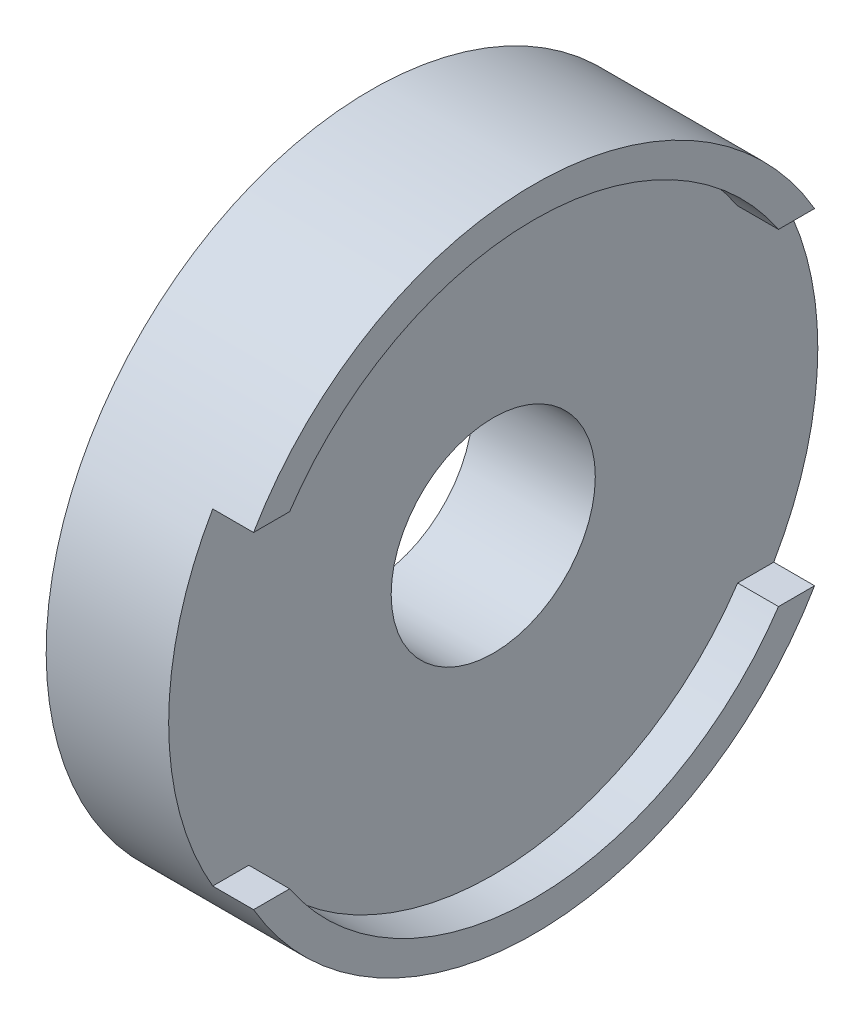
ISO-10303-21;
HEADER;
FILE_DESCRIPTION(('STEP AP214'),'2;1');
FILE_NAME('part.step','',(''),(''),'','','');
FILE_SCHEMA(('AUTOMOTIVE_DESIGN { 1 0 10303 214 1 1 1 1 }'));
ENDSEC;
DATA;
#1=APPLICATION_CONTEXT('core data for automotive mechanical design processes');
#2=APPLICATION_PROTOCOL_DEFINITION('international standard','automotive_design',2000,#1);
#3=PRODUCT_CONTEXT('',#1,'mechanical');
#4=PRODUCT('Part','Part','',(#3));
#5=PRODUCT_RELATED_PRODUCT_CATEGORY('part','',(#4));
#6=PRODUCT_DEFINITION_FORMATION('','',#4);
#7=PRODUCT_DEFINITION_CONTEXT('part definition',#1,'design');
#8=PRODUCT_DEFINITION('design','',#6,#7);
#9=PRODUCT_DEFINITION_SHAPE('','',#8);
#10=(LENGTH_UNIT() NAMED_UNIT(*) SI_UNIT(.MILLI.,.METRE.));
#11=(NAMED_UNIT(*) PLANE_ANGLE_UNIT() SI_UNIT($,.RADIAN.));
#12=(NAMED_UNIT(*) SI_UNIT($,.STERADIAN.) SOLID_ANGLE_UNIT());
#13=UNCERTAINTY_MEASURE_WITH_UNIT(LENGTH_MEASURE(1.E-05),#10,'distance_accuracy_value','');
#14=(GEOMETRIC_REPRESENTATION_CONTEXT(3) GLOBAL_UNCERTAINTY_ASSIGNED_CONTEXT((#13)) GLOBAL_UNIT_ASSIGNED_CONTEXT((#10,
#11,#12)) REPRESENTATION_CONTEXT('',''));
#15=CARTESIAN_POINT('',(0.,0.,0.));
#16=DIRECTION('',(0.,0.,1.));
#17=DIRECTION('',(1.,0.,0.));
#18=AXIS2_PLACEMENT_3D('',#15,#16,#17);
#19=CARTESIAN_POINT('',(6.,0.,0.));
#20=DIRECTION('',(1.,0.,0.));
#21=DIRECTION('',(0.,0.,-1.));
#22=AXIS2_PLACEMENT_3D('',#19,#20,#21);
#23=PLANE('',#22);
#24=CARTESIAN_POINT('',(6.,0.,0.));
#25=DIRECTION('',(1.,0.,0.));
#26=DIRECTION('',(0.,0.,-1.));
#27=AXIS2_PLACEMENT_3D('',#24,#25,#26);
#28=CIRCLE('',#27,5.);
#29=CARTESIAN_POINT('',(6.,0.,-5.));
#30=VERTEX_POINT('',#29);
#31=EDGE_CURVE('E192',#30,#30,#28,.T.);
#32=ORIENTED_EDGE('',*,*,#31,.F.);
#33=EDGE_LOOP('',(#32));
#34=FACE_BOUND('',#33,.T.);
#35=CARTESIAN_POINT('',(6.,0.,0.));
#36=DIRECTION('',(1.,0.,0.));
#37=DIRECTION('',(0.,0.,-1.));
#38=AXIS2_PLACEMENT_3D('',#35,#36,#37);
#39=CIRCLE('',#38,15.9);
#40=CARTESIAN_POINT('',(6.,8.,13.7408151141044));
#41=VERTEX_POINT('',#40);
#42=CARTESIAN_POINT('',(6.,-8.,13.7408151141044));
#43=VERTEX_POINT('',#42);
#44=EDGE_CURVE('E11',#41,#43,#39,.T.);
#45=ORIENTED_EDGE('',*,*,#44,.T.);
#46=DIRECTION('',(0.,0.,1.));
#47=VECTOR('',#46,1.);
#48=CARTESIAN_POINT('',(6.,-8.,13.7408151141044));
#49=LINE('',#48,#47);
#50=CARTESIAN_POINT('',(6.,-8.,11.9733036376766));
#51=VERTEX_POINT('',#50);
#52=EDGE_CURVE('E48',#51,#43,#49,.T.);
#53=ORIENTED_EDGE('',*,*,#52,.F.);
#54=CARTESIAN_POINT('',(6.,0.,0.));
#55=DIRECTION('',(-1.,0.,0.));
#56=DIRECTION('',(0.,0.,-1.));
#57=AXIS2_PLACEMENT_3D('',#54,#55,#56);
#58=CIRCLE('',#57,14.4);
#59=CARTESIAN_POINT('',(6.,-8.,-11.9733036376766));
#60=VERTEX_POINT('',#59);
#61=EDGE_CURVE('E53',#60,#51,#58,.T.);
#62=ORIENTED_EDGE('',*,*,#61,.F.);
#63=DIRECTION('',(0.,0.,1.));
#64=VECTOR('',#63,1.);
#65=CARTESIAN_POINT('',(6.,-8.,-11.9733036376766));
#66=LINE('',#65,#64);
#67=CARTESIAN_POINT('',(6.,-8.,-13.7408151141044));
#68=VERTEX_POINT('',#67);
#69=EDGE_CURVE('E116',#68,#60,#66,.T.);
#70=ORIENTED_EDGE('',*,*,#69,.F.);
#71=CARTESIAN_POINT('',(6.,8.,-13.7408151141044));
#72=VERTEX_POINT('',#71);
#73=EDGE_CURVE('E36',#68,#72,#39,.T.);
#74=ORIENTED_EDGE('',*,*,#73,.T.);
#75=DIRECTION('',(0.,0.,-1.));
#76=VECTOR('',#75,1.);
#77=CARTESIAN_POINT('',(6.,8.,-11.9733036376766));
#78=LINE('',#77,#76);
#79=CARTESIAN_POINT('',(6.,8.,-11.9733036376766));
#80=VERTEX_POINT('',#79);
#81=EDGE_CURVE('E122',#80,#72,#78,.T.);
#82=ORIENTED_EDGE('',*,*,#81,.F.);
#83=CARTESIAN_POINT('',(6.,0.,0.));
#84=DIRECTION('',(-1.,0.,0.));
#85=DIRECTION('',(0.,0.,-1.));
#86=AXIS2_PLACEMENT_3D('',#83,#84,#85);
#87=CIRCLE('',#86,14.4);
#88=CARTESIAN_POINT('',(6.,8.,11.9733036376766));
#89=VERTEX_POINT('',#88);
#90=EDGE_CURVE('E119',#89,#80,#87,.T.);
#91=ORIENTED_EDGE('',*,*,#90,.F.);
#92=DIRECTION('',(0.,0.,-1.));
#93=VECTOR('',#92,1.);
#94=CARTESIAN_POINT('',(6.,8.,13.7408151141044));
#95=LINE('',#94,#93);
#96=EDGE_CURVE('E132',#41,#89,#95,.T.);
#97=ORIENTED_EDGE('',*,*,#96,.F.);
#98=EDGE_LOOP('',(#45,#53,#62,#70,#74,#82,#91,#97));
#99=FACE_BOUND('',#98,.T.);
#100=ADVANCED_FACE('F32',(#34,#99),#23,.T.);
#101=CARTESIAN_POINT('',(0.,0.,0.));
#102=DIRECTION('',(1.,0.,0.));
#103=DIRECTION('',(0.,0.,-1.));
#104=AXIS2_PLACEMENT_3D('',#101,#102,#103);
#105=PLANE('',#104);
#106=CARTESIAN_POINT('',(0.,0.,0.));
#107=DIRECTION('',(1.,0.,0.));
#108=DIRECTION('',(0.,0.,-1.));
#109=AXIS2_PLACEMENT_3D('',#106,#107,#108);
#110=CIRCLE('',#109,15.9);
#111=CARTESIAN_POINT('',(0.,0.,-15.9));
#112=VERTEX_POINT('',#111);
#113=EDGE_CURVE('E184',#112,#112,#110,.T.);
#114=ORIENTED_EDGE('',*,*,#113,.F.);
#115=EDGE_LOOP('',(#114));
#116=FACE_BOUND('',#115,.T.);
#117=CARTESIAN_POINT('',(0.,0.,0.));
#118=DIRECTION('',(1.,0.,0.));
#119=DIRECTION('',(0.,0.,-1.));
#120=AXIS2_PLACEMENT_3D('',#117,#118,#119);
#121=CIRCLE('',#120,5.);
#122=CARTESIAN_POINT('',(0.,0.,-5.));
#123=VERTEX_POINT('',#122);
#124=EDGE_CURVE('E190',#123,#123,#121,.T.);
#125=ORIENTED_EDGE('',*,*,#124,.T.);
#126=EDGE_LOOP('',(#125));
#127=FACE_BOUND('',#126,.T.);
#128=ADVANCED_FACE('F202',(#116,#127),#105,.F.);
#129=CARTESIAN_POINT('',(6.,0.,0.));
#130=DIRECTION('',(-1.,0.,0.));
#131=DIRECTION('',(0.,0.,1.));
#132=AXIS2_PLACEMENT_3D('',#129,#130,#131);
#133=CYLINDRICAL_SURFACE('',#132,15.9);
#134=ORIENTED_EDGE('',*,*,#44,.F.);
#135=DIRECTION('',(-1.,0.,0.));
#136=VECTOR('',#135,1.);
#137=CARTESIAN_POINT('',(8.,8.,13.7408151141044));
#138=LINE('',#137,#136);
#139=CARTESIAN_POINT('',(8.,8.,13.7408151141044));
#140=VERTEX_POINT('',#139);
#141=EDGE_CURVE('E149',#140,#41,#138,.T.);
#142=ORIENTED_EDGE('',*,*,#141,.F.);
#143=CARTESIAN_POINT('',(8.,0.,0.));
#144=DIRECTION('',(1.,0.,0.));
#145=DIRECTION('',(0.,0.,-1.));
#146=AXIS2_PLACEMENT_3D('',#143,#144,#145);
#147=CIRCLE('',#146,15.9);
#148=CARTESIAN_POINT('',(8.,8.,-13.7408151141044));
#149=VERTEX_POINT('',#148);
#150=EDGE_CURVE('E134',#149,#140,#147,.T.);
#151=ORIENTED_EDGE('',*,*,#150,.F.);
#152=DIRECTION('',(-1.,0.,0.));
#153=VECTOR('',#152,1.);
#154=CARTESIAN_POINT('',(8.,8.,-13.7408151141044));
#155=LINE('',#154,#153);
#156=EDGE_CURVE('E145',#149,#72,#155,.T.);
#157=ORIENTED_EDGE('',*,*,#156,.T.);
#158=ORIENTED_EDGE('',*,*,#73,.F.);
#159=DIRECTION('',(-1.,0.,0.));
#160=VECTOR('',#159,1.);
#161=CARTESIAN_POINT('',(8.,-8.,-13.7408151141044));
#162=LINE('',#161,#160);
#163=CARTESIAN_POINT('',(8.,-8.,-13.7408151141044));
#164=VERTEX_POINT('',#163);
#165=EDGE_CURVE('E124',#164,#68,#162,.T.);
#166=ORIENTED_EDGE('',*,*,#165,.F.);
#167=CARTESIAN_POINT('',(8.,0.,0.));
#168=DIRECTION('',(1.,0.,0.));
#169=DIRECTION('',(0.,0.,-1.));
#170=AXIS2_PLACEMENT_3D('',#167,#168,#169);
#171=CIRCLE('',#170,15.9);
#172=CARTESIAN_POINT('',(8.,-8.,13.7408151141044));
#173=VERTEX_POINT('',#172);
#174=EDGE_CURVE('E106',#173,#164,#171,.T.);
#175=ORIENTED_EDGE('',*,*,#174,.F.);
#176=DIRECTION('',(-1.,0.,0.));
#177=VECTOR('',#176,1.);
#178=CARTESIAN_POINT('',(8.,-8.,13.7408151141044));
#179=LINE('',#178,#177);
#180=EDGE_CURVE('E103',#173,#43,#179,.T.);
#181=ORIENTED_EDGE('',*,*,#180,.T.);
#182=EDGE_LOOP('',(#134,#142,#151,#157,#158,#166,#175,#181));
#183=FACE_BOUND('',#182,.T.);
#184=ORIENTED_EDGE('',*,*,#113,.T.);
#185=EDGE_LOOP('',(#184));
#186=FACE_BOUND('',#185,.T.);
#187=ADVANCED_FACE('F34',(#183,#186),#133,.T.);
#188=CARTESIAN_POINT('',(6.,0.,0.));
#189=DIRECTION('',(-1.,0.,0.));
#190=DIRECTION('',(0.,0.,1.));
#191=AXIS2_PLACEMENT_3D('',#188,#189,#190);
#192=CYLINDRICAL_SURFACE('',#191,5.);
#193=ORIENTED_EDGE('',*,*,#31,.T.);
#194=EDGE_LOOP('',(#193));
#195=FACE_BOUND('',#194,.T.);
#196=ORIENTED_EDGE('',*,*,#124,.F.);
#197=EDGE_LOOP('',(#196));
#198=FACE_BOUND('',#197,.T.);
#199=ADVANCED_FACE('F207',(#195,#198),#192,.F.);
#200=CARTESIAN_POINT('',(8.,0.,0.));
#201=DIRECTION('',(-1.,0.,0.));
#202=DIRECTION('',(0.,0.,1.));
#203=AXIS2_PLACEMENT_3D('',#200,#201,#202);
#204=CYLINDRICAL_SURFACE('',#203,14.4);
#205=ORIENTED_EDGE('',*,*,#90,.T.);
#206=DIRECTION('',(-1.,0.,0.));
#207=VECTOR('',#206,1.);
#208=CARTESIAN_POINT('',(8.,8.,-11.9733036376766));
#209=LINE('',#208,#207);
#210=CARTESIAN_POINT('',(8.,8.,-11.9733036376766));
#211=VERTEX_POINT('',#210);
#212=EDGE_CURVE('E148',#211,#80,#209,.T.);
#213=ORIENTED_EDGE('',*,*,#212,.F.);
#214=CARTESIAN_POINT('',(8.,0.,0.));
#215=DIRECTION('',(-1.,0.,0.));
#216=DIRECTION('',(0.,0.,-1.));
#217=AXIS2_PLACEMENT_3D('',#214,#215,#216);
#218=CIRCLE('',#217,14.4);
#219=CARTESIAN_POINT('',(8.,8.,11.9733036376766));
#220=VERTEX_POINT('',#219);
#221=EDGE_CURVE('E128',#220,#211,#218,.T.);
#222=ORIENTED_EDGE('',*,*,#221,.F.);
#223=DIRECTION('',(-1.,0.,0.));
#224=VECTOR('',#223,1.);
#225=CARTESIAN_POINT('',(8.,8.,11.9733036376766));
#226=LINE('',#225,#224);
#227=EDGE_CURVE('E137',#220,#89,#226,.T.);
#228=ORIENTED_EDGE('',*,*,#227,.T.);
#229=EDGE_LOOP('',(#205,#213,#222,#228));
#230=FACE_BOUND('',#229,.T.);
#231=ADVANCED_FACE('F165',(#230),#204,.F.);
#232=CARTESIAN_POINT('',(8.,8.,-11.9733036376766));
#233=DIRECTION('',(0.,1.,0.));
#234=DIRECTION('',(0.,0.,1.));
#235=AXIS2_PLACEMENT_3D('',#232,#233,#234);
#236=PLANE('',#235);
#237=ORIENTED_EDGE('',*,*,#81,.T.);
#238=ORIENTED_EDGE('',*,*,#156,.F.);
#239=DIRECTION('',(0.,0.,-1.));
#240=VECTOR('',#239,1.);
#241=CARTESIAN_POINT('',(8.,8.,-11.9733036376766));
#242=LINE('',#241,#240);
#243=EDGE_CURVE('E131',#211,#149,#242,.T.);
#244=ORIENTED_EDGE('',*,*,#243,.F.);
#245=ORIENTED_EDGE('',*,*,#212,.T.);
#246=EDGE_LOOP('',(#237,#238,#244,#245));
#247=FACE_BOUND('',#246,.T.);
#248=ADVANCED_FACE('F187',(#247),#236,.F.);
#249=CARTESIAN_POINT('',(8.,8.,13.7408151141044));
#250=DIRECTION('',(0.,1.,0.));
#251=DIRECTION('',(0.,0.,1.));
#252=AXIS2_PLACEMENT_3D('',#249,#250,#251);
#253=PLANE('',#252);
#254=ORIENTED_EDGE('',*,*,#96,.T.);
#255=ORIENTED_EDGE('',*,*,#227,.F.);
#256=DIRECTION('',(0.,0.,-1.));
#257=VECTOR('',#256,1.);
#258=CARTESIAN_POINT('',(8.,8.,13.7408151141044));
#259=LINE('',#258,#257);
#260=EDGE_CURVE('E136',#140,#220,#259,.T.);
#261=ORIENTED_EDGE('',*,*,#260,.F.);
#262=ORIENTED_EDGE('',*,*,#141,.T.);
#263=EDGE_LOOP('',(#254,#255,#261,#262));
#264=FACE_BOUND('',#263,.T.);
#265=ADVANCED_FACE('F167',(#264),#253,.F.);
#266=CARTESIAN_POINT('',(8.,0.,0.));
#267=DIRECTION('',(1.,0.,0.));
#268=DIRECTION('',(0.,0.,-1.));
#269=AXIS2_PLACEMENT_3D('',#266,#267,#268);
#270=PLANE('',#269);
#271=ORIENTED_EDGE('',*,*,#221,.T.);
#272=ORIENTED_EDGE('',*,*,#243,.T.);
#273=ORIENTED_EDGE('',*,*,#150,.T.);
#274=ORIENTED_EDGE('',*,*,#260,.T.);
#275=EDGE_LOOP('',(#271,#272,#273,#274));
#276=FACE_BOUND('',#275,.T.);
#277=ADVANCED_FACE('F189',(#276),#270,.T.);
#278=CARTESIAN_POINT('',(8.,0.,0.));
#279=DIRECTION('',(-1.,0.,0.));
#280=DIRECTION('',(0.,0.,1.));
#281=AXIS2_PLACEMENT_3D('',#278,#279,#280);
#282=CYLINDRICAL_SURFACE('',#281,14.4);
#283=ORIENTED_EDGE('',*,*,#61,.T.);
#284=DIRECTION('',(-1.,0.,0.));
#285=VECTOR('',#284,1.);
#286=CARTESIAN_POINT('',(8.,-8.,11.9733036376766));
#287=LINE('',#286,#285);
#288=CARTESIAN_POINT('',(8.,-8.,11.9733036376766));
#289=VERTEX_POINT('',#288);
#290=EDGE_CURVE('E101',#289,#51,#287,.T.);
#291=ORIENTED_EDGE('',*,*,#290,.F.);
#292=CARTESIAN_POINT('',(8.,0.,0.));
#293=DIRECTION('',(-1.,0.,0.));
#294=DIRECTION('',(0.,0.,-1.));
#295=AXIS2_PLACEMENT_3D('',#292,#293,#294);
#296=CIRCLE('',#295,14.4);
#297=CARTESIAN_POINT('',(8.,-8.,-11.9733036376766));
#298=VERTEX_POINT('',#297);
#299=EDGE_CURVE('E107',#298,#289,#296,.T.);
#300=ORIENTED_EDGE('',*,*,#299,.F.);
#301=DIRECTION('',(-1.,0.,0.));
#302=VECTOR('',#301,1.);
#303=CARTESIAN_POINT('',(8.,-8.,-11.9733036376766));
#304=LINE('',#303,#302);
#305=EDGE_CURVE('E175',#298,#60,#304,.T.);
#306=ORIENTED_EDGE('',*,*,#305,.T.);
#307=EDGE_LOOP('',(#283,#291,#300,#306));
#308=FACE_BOUND('',#307,.T.);
#309=ADVANCED_FACE('F118',(#308),#282,.F.);
#310=CARTESIAN_POINT('',(8.,-8.,13.7408151141044));
#311=DIRECTION('',(0.,-1.,0.));
#312=DIRECTION('',(0.,0.,-1.));
#313=AXIS2_PLACEMENT_3D('',#310,#311,#312);
#314=PLANE('',#313);
#315=ORIENTED_EDGE('',*,*,#52,.T.);
#316=ORIENTED_EDGE('',*,*,#180,.F.);
#317=DIRECTION('',(0.,0.,1.));
#318=VECTOR('',#317,1.);
#319=CARTESIAN_POINT('',(8.,-8.,13.7408151141044));
#320=LINE('',#319,#318);
#321=EDGE_CURVE('E97',#289,#173,#320,.T.);
#322=ORIENTED_EDGE('',*,*,#321,.F.);
#323=ORIENTED_EDGE('',*,*,#290,.T.);
#324=EDGE_LOOP('',(#315,#316,#322,#323));
#325=FACE_BOUND('',#324,.T.);
#326=ADVANCED_FACE('F99',(#325),#314,.F.);
#327=CARTESIAN_POINT('',(8.,-8.,-11.9733036376766));
#328=DIRECTION('',(0.,-1.,0.));
#329=DIRECTION('',(0.,0.,-1.));
#330=AXIS2_PLACEMENT_3D('',#327,#328,#329);
#331=PLANE('',#330);
#332=ORIENTED_EDGE('',*,*,#69,.T.);
#333=ORIENTED_EDGE('',*,*,#305,.F.);
#334=DIRECTION('',(0.,0.,1.));
#335=VECTOR('',#334,1.);
#336=CARTESIAN_POINT('',(8.,-8.,-11.9733036376766));
#337=LINE('',#336,#335);
#338=EDGE_CURVE('E112',#164,#298,#337,.T.);
#339=ORIENTED_EDGE('',*,*,#338,.F.);
#340=ORIENTED_EDGE('',*,*,#165,.T.);
#341=EDGE_LOOP('',(#332,#333,#339,#340));
#342=FACE_BOUND('',#341,.T.);
#343=ADVANCED_FACE('F182',(#342),#331,.F.);
#344=CARTESIAN_POINT('',(8.,0.,0.));
#345=DIRECTION('',(1.,0.,0.));
#346=DIRECTION('',(0.,0.,-1.));
#347=AXIS2_PLACEMENT_3D('',#344,#345,#346);
#348=PLANE('',#347);
#349=ORIENTED_EDGE('',*,*,#299,.T.);
#350=ORIENTED_EDGE('',*,*,#321,.T.);
#351=ORIENTED_EDGE('',*,*,#174,.T.);
#352=ORIENTED_EDGE('',*,*,#338,.T.);
#353=EDGE_LOOP('',(#349,#350,#351,#352));
#354=FACE_BOUND('',#353,.T.);
#355=ADVANCED_FACE('F110',(#354),#348,.T.);
#356=CLOSED_SHELL('',(#100,#128,#187,#199,#231,#248,#265,#277,#309,#326,#343,#355));
#357=MANIFOLD_SOLID_BREP('B2',#356);
#358=ADVANCED_BREP_SHAPE_REPRESENTATION('',(#18,#357),#14);
#359=SHAPE_DEFINITION_REPRESENTATION(#9,#358);
ENDSEC;
END-ISO-10303-21;
